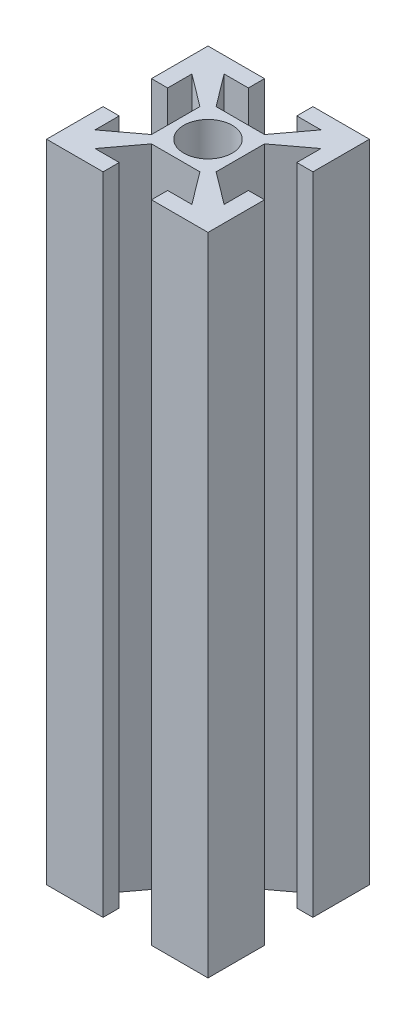
ISO-10303-21;
HEADER;
FILE_DESCRIPTION(('STEP AP214'),'2;1');
FILE_NAME('part.step','',(''),(''),'','','');
FILE_SCHEMA(('AUTOMOTIVE_DESIGN { 1 0 10303 214 1 1 1 1 }'));
ENDSEC;
DATA;
#1=APPLICATION_CONTEXT('core data for automotive mechanical design processes');
#2=APPLICATION_PROTOCOL_DEFINITION('international standard','automotive_design',2000,#1);
#3=PRODUCT_CONTEXT('',#1,'mechanical');
#4=PRODUCT('Part','Part','',(#3));
#5=PRODUCT_RELATED_PRODUCT_CATEGORY('part','',(#4));
#6=PRODUCT_DEFINITION_FORMATION('','',#4);
#7=PRODUCT_DEFINITION_CONTEXT('part definition',#1,'design');
#8=PRODUCT_DEFINITION('design','',#6,#7);
#9=PRODUCT_DEFINITION_SHAPE('','',#8);
#10=(LENGTH_UNIT() NAMED_UNIT(*) SI_UNIT(.MILLI.,.METRE.));
#11=(NAMED_UNIT(*) PLANE_ANGLE_UNIT() SI_UNIT($,.RADIAN.));
#12=(NAMED_UNIT(*) SI_UNIT($,.STERADIAN.) SOLID_ANGLE_UNIT());
#13=UNCERTAINTY_MEASURE_WITH_UNIT(LENGTH_MEASURE(1.E-05),#10,'distance_accuracy_value','');
#14=(GEOMETRIC_REPRESENTATION_CONTEXT(3) GLOBAL_UNCERTAINTY_ASSIGNED_CONTEXT((#13)) GLOBAL_UNIT_ASSIGNED_CONTEXT((#10,
#11,#12)) REPRESENTATION_CONTEXT('',''));
#15=CARTESIAN_POINT('',(0.,0.,0.));
#16=DIRECTION('',(0.,0.,1.));
#17=DIRECTION('',(1.,0.,0.));
#18=AXIS2_PLACEMENT_3D('',#15,#16,#17);
#19=CARTESIAN_POINT('',(0.,80.,-10.));
#20=DIRECTION('',(0.,0.,-1.));
#21=DIRECTION('',(-1.,0.,0.));
#22=AXIS2_PLACEMENT_3D('',#19,#20,#21);
#23=PLANE('',#22);
#24=DIRECTION('',(1.,0.,0.));
#25=VECTOR('',#24,1.);
#26=CARTESIAN_POINT('',(0.,0.,-10.));
#27=LINE('',#26,#25);
#28=CARTESIAN_POINT('',(3.,0.,-10.));
#29=VERTEX_POINT('',#28);
#30=CARTESIAN_POINT('',(10.,0.,-10.));
#31=VERTEX_POINT('',#30);
#32=EDGE_CURVE('E316',#29,#31,#27,.T.);
#33=ORIENTED_EDGE('',*,*,#32,.F.);
#34=DIRECTION('',(0.,-1.,0.));
#35=VECTOR('',#34,1.);
#36=CARTESIAN_POINT('',(3.,80.,-10.));
#37=LINE('',#36,#35);
#38=CARTESIAN_POINT('',(3.,80.,-10.));
#39=VERTEX_POINT('',#38);
#40=EDGE_CURVE('E11',#39,#29,#37,.T.);
#41=ORIENTED_EDGE('',*,*,#40,.F.);
#42=DIRECTION('',(1.,0.,0.));
#43=VECTOR('',#42,1.);
#44=CARTESIAN_POINT('',(0.,80.,-10.));
#45=LINE('',#44,#43);
#46=CARTESIAN_POINT('',(10.,80.,-10.));
#47=VERTEX_POINT('',#46);
#48=EDGE_CURVE('E586',#39,#47,#45,.T.);
#49=ORIENTED_EDGE('',*,*,#48,.T.);
#50=DIRECTION('',(0.,-1.,0.));
#51=VECTOR('',#50,1.);
#52=CARTESIAN_POINT('',(10.,80.,-10.));
#53=LINE('',#52,#51);
#54=EDGE_CURVE('E59',#47,#31,#53,.T.);
#55=ORIENTED_EDGE('',*,*,#54,.T.);
#56=EDGE_LOOP('',(#33,#41,#49,#55));
#57=FACE_BOUND('',#56,.T.);
#58=ADVANCED_FACE('F41',(#57),#23,.T.);
#59=CARTESIAN_POINT('',(3.,80.,0.));
#60=DIRECTION('',(1.,0.,0.));
#61=DIRECTION('',(0.,0.,-1.));
#62=AXIS2_PLACEMENT_3D('',#59,#60,#61);
#63=PLANE('',#62);
#64=DIRECTION('',(0.,0.,1.));
#65=VECTOR('',#64,1.);
#66=CARTESIAN_POINT('',(3.,0.,0.));
#67=LINE('',#66,#65);
#68=CARTESIAN_POINT('',(3.,0.,-8.));
#69=VERTEX_POINT('',#68);
#70=EDGE_CURVE('E319',#29,#69,#67,.T.);
#71=ORIENTED_EDGE('',*,*,#70,.T.);
#72=DIRECTION('',(0.,-1.,0.));
#73=VECTOR('',#72,1.);
#74=CARTESIAN_POINT('',(3.,80.,-8.));
#75=LINE('',#74,#73);
#76=CARTESIAN_POINT('',(3.,80.,-8.));
#77=VERTEX_POINT('',#76);
#78=EDGE_CURVE('E51',#77,#69,#75,.T.);
#79=ORIENTED_EDGE('',*,*,#78,.F.);
#80=DIRECTION('',(0.,0.,1.));
#81=VECTOR('',#80,1.);
#82=CARTESIAN_POINT('',(3.,80.,0.));
#83=LINE('',#82,#81);
#84=EDGE_CURVE('E579',#39,#77,#83,.T.);
#85=ORIENTED_EDGE('',*,*,#84,.F.);
#86=ORIENTED_EDGE('',*,*,#40,.T.);
#87=EDGE_LOOP('',(#71,#79,#85,#86));
#88=FACE_BOUND('',#87,.T.);
#89=ADVANCED_FACE('F567',(#88),#63,.F.);
#90=CARTESIAN_POINT('',(0.,80.,-7.99999999999999));
#91=DIRECTION('',(0.,0.,1.));
#92=DIRECTION('',(1.,0.,0.));
#93=AXIS2_PLACEMENT_3D('',#90,#91,#92);
#94=PLANE('',#93);
#95=DIRECTION('',(-1.,0.,0.));
#96=VECTOR('',#95,1.);
#97=CARTESIAN_POINT('',(0.,0.,-7.99999999999999));
#98=LINE('',#97,#96);
#99=CARTESIAN_POINT('',(6.,0.,-8.));
#100=VERTEX_POINT('',#99);
#101=EDGE_CURVE('E323',#100,#69,#98,.T.);
#102=ORIENTED_EDGE('',*,*,#101,.F.);
#103=DIRECTION('',(0.,-1.,0.));
#104=VECTOR('',#103,1.);
#105=CARTESIAN_POINT('',(6.,80.,-8.));
#106=LINE('',#105,#104);
#107=CARTESIAN_POINT('',(6.,80.,-8.));
#108=VERTEX_POINT('',#107);
#109=EDGE_CURVE('E555',#108,#100,#106,.T.);
#110=ORIENTED_EDGE('',*,*,#109,.F.);
#111=DIRECTION('',(-1.,0.,0.));
#112=VECTOR('',#111,1.);
#113=CARTESIAN_POINT('',(0.,80.,-7.99999999999999));
#114=LINE('',#113,#112);
#115=EDGE_CURVE('E564',#108,#77,#114,.T.);
#116=ORIENTED_EDGE('',*,*,#115,.T.);
#117=ORIENTED_EDGE('',*,*,#78,.T.);
#118=EDGE_LOOP('',(#102,#110,#116,#117));
#119=FACE_BOUND('',#118,.T.);
#120=ADVANCED_FACE('F562',(#119),#94,.T.);
#121=CARTESIAN_POINT('',(0.,80.,0.));
#122=DIRECTION('',(-0.799999999999999,0.,-0.600000000000001));
#123=DIRECTION('',(-0.600000000000001,0.,0.799999999999999));
#124=AXIS2_PLACEMENT_3D('',#121,#122,#123);
#125=PLANE('',#124);
#126=DIRECTION('',(0.600000000000001,0.,-0.799999999999999));
#127=VECTOR('',#126,1.);
#128=CARTESIAN_POINT('',(0.,0.,0.));
#129=LINE('',#128,#127);
#130=CARTESIAN_POINT('',(3.,0.,-4.00000000000002));
#131=VERTEX_POINT('',#130);
#132=EDGE_CURVE('E327',#131,#100,#129,.T.);
#133=ORIENTED_EDGE('',*,*,#132,.F.);
#134=DIRECTION('',(0.,-1.,0.));
#135=VECTOR('',#134,1.);
#136=CARTESIAN_POINT('',(3.,80.,-4.00000000000002));
#137=LINE('',#136,#135);
#138=CARTESIAN_POINT('',(3.,80.,-4.00000000000002));
#139=VERTEX_POINT('',#138);
#140=EDGE_CURVE('E552',#139,#131,#137,.T.);
#141=ORIENTED_EDGE('',*,*,#140,.F.);
#142=DIRECTION('',(0.600000000000001,0.,-0.799999999999999));
#143=VECTOR('',#142,1.);
#144=CARTESIAN_POINT('',(0.,80.,0.));
#145=LINE('',#144,#143);
#146=EDGE_CURVE('E576',#139,#108,#145,.T.);
#147=ORIENTED_EDGE('',*,*,#146,.T.);
#148=ORIENTED_EDGE('',*,*,#109,.T.);
#149=EDGE_LOOP('',(#133,#141,#147,#148));
#150=FACE_BOUND('',#149,.T.);
#151=ADVANCED_FACE('F573',(#150),#125,.T.);
#152=CARTESIAN_POINT('',(0.,80.,-4.00000000000002));
#153=DIRECTION('',(0.,0.,-1.));
#154=DIRECTION('',(-1.,0.,0.));
#155=AXIS2_PLACEMENT_3D('',#152,#153,#154);
#156=PLANE('',#155);
#157=DIRECTION('',(1.,0.,0.));
#158=VECTOR('',#157,1.);
#159=CARTESIAN_POINT('',(0.,0.,-4.00000000000002));
#160=LINE('',#159,#158);
#161=CARTESIAN_POINT('',(-3.,0.,-4.00000000000002));
#162=VERTEX_POINT('',#161);
#163=EDGE_CURVE('E331',#162,#131,#160,.T.);
#164=ORIENTED_EDGE('',*,*,#163,.F.);
#165=DIRECTION('',(0.,-1.,0.));
#166=VECTOR('',#165,1.);
#167=CARTESIAN_POINT('',(-3.,80.,-4.00000000000002));
#168=LINE('',#167,#166);
#169=CARTESIAN_POINT('',(-3.,80.,-4.00000000000002));
#170=VERTEX_POINT('',#169);
#171=EDGE_CURVE('E549',#170,#162,#168,.T.);
#172=ORIENTED_EDGE('',*,*,#171,.F.);
#173=DIRECTION('',(1.,0.,0.));
#174=VECTOR('',#173,1.);
#175=CARTESIAN_POINT('',(0.,80.,-4.00000000000002));
#176=LINE('',#175,#174);
#177=EDGE_CURVE('E584',#170,#139,#176,.T.);
#178=ORIENTED_EDGE('',*,*,#177,.T.);
#179=ORIENTED_EDGE('',*,*,#140,.T.);
#180=EDGE_LOOP('',(#164,#172,#178,#179));
#181=FACE_BOUND('',#180,.T.);
#182=ADVANCED_FACE('F722',(#181),#156,.T.);
#183=CARTESIAN_POINT('',(0.,80.,0.));
#184=DIRECTION('',(0.799999999999999,0.,-0.600000000000001));
#185=DIRECTION('',(-0.600000000000001,0.,-0.799999999999999));
#186=AXIS2_PLACEMENT_3D('',#183,#184,#185);
#187=PLANE('',#186);
#188=DIRECTION('',(0.600000000000001,0.,0.799999999999999));
#189=VECTOR('',#188,1.);
#190=CARTESIAN_POINT('',(0.,0.,0.));
#191=LINE('',#190,#189);
#192=CARTESIAN_POINT('',(-6.,0.,-8.));
#193=VERTEX_POINT('',#192);
#194=EDGE_CURVE('E335',#193,#162,#191,.T.);
#195=ORIENTED_EDGE('',*,*,#194,.F.);
#196=DIRECTION('',(0.,-1.,0.));
#197=VECTOR('',#196,1.);
#198=CARTESIAN_POINT('',(-6.,80.,-8.));
#199=LINE('',#198,#197);
#200=CARTESIAN_POINT('',(-6.,80.,-8.));
#201=VERTEX_POINT('',#200);
#202=EDGE_CURVE('E546',#201,#193,#199,.T.);
#203=ORIENTED_EDGE('',*,*,#202,.F.);
#204=DIRECTION('',(0.600000000000001,0.,0.799999999999999));
#205=VECTOR('',#204,1.);
#206=CARTESIAN_POINT('',(0.,80.,0.));
#207=LINE('',#206,#205);
#208=EDGE_CURVE('E592',#201,#170,#207,.T.);
#209=ORIENTED_EDGE('',*,*,#208,.T.);
#210=ORIENTED_EDGE('',*,*,#171,.T.);
#211=EDGE_LOOP('',(#195,#203,#209,#210));
#212=FACE_BOUND('',#211,.T.);
#213=ADVANCED_FACE('F725',(#212),#187,.T.);
#214=CARTESIAN_POINT('',(0.,80.,-8.));
#215=DIRECTION('',(0.,0.,1.));
#216=DIRECTION('',(1.,0.,0.));
#217=AXIS2_PLACEMENT_3D('',#214,#215,#216);
#218=PLANE('',#217);
#219=DIRECTION('',(-1.,0.,0.));
#220=VECTOR('',#219,1.);
#221=CARTESIAN_POINT('',(0.,0.,-8.));
#222=LINE('',#221,#220);
#223=CARTESIAN_POINT('',(-3.,0.,-8.));
#224=VERTEX_POINT('',#223);
#225=EDGE_CURVE('E339',#224,#193,#222,.T.);
#226=ORIENTED_EDGE('',*,*,#225,.F.);
#227=DIRECTION('',(0.,-1.,0.));
#228=VECTOR('',#227,1.);
#229=CARTESIAN_POINT('',(-3.,80.,-8.));
#230=LINE('',#229,#228);
#231=CARTESIAN_POINT('',(-3.,80.,-8.));
#232=VERTEX_POINT('',#231);
#233=EDGE_CURVE('E543',#232,#224,#230,.T.);
#234=ORIENTED_EDGE('',*,*,#233,.F.);
#235=DIRECTION('',(-1.,0.,0.));
#236=VECTOR('',#235,1.);
#237=CARTESIAN_POINT('',(0.,80.,-8.));
#238=LINE('',#237,#236);
#239=EDGE_CURVE('E596',#232,#201,#238,.T.);
#240=ORIENTED_EDGE('',*,*,#239,.T.);
#241=ORIENTED_EDGE('',*,*,#202,.T.);
#242=EDGE_LOOP('',(#226,#234,#240,#241));
#243=FACE_BOUND('',#242,.T.);
#244=ADVANCED_FACE('F729',(#243),#218,.T.);
#245=CARTESIAN_POINT('',(-3.,80.,0.));
#246=DIRECTION('',(-1.,0.,0.));
#247=DIRECTION('',(0.,0.,1.));
#248=AXIS2_PLACEMENT_3D('',#245,#246,#247);
#249=PLANE('',#248);
#250=DIRECTION('',(0.,0.,-1.));
#251=VECTOR('',#250,1.);
#252=CARTESIAN_POINT('',(-3.,0.,0.));
#253=LINE('',#252,#251);
#254=CARTESIAN_POINT('',(-3.,0.,-10.));
#255=VERTEX_POINT('',#254);
#256=EDGE_CURVE('E343',#224,#255,#253,.T.);
#257=ORIENTED_EDGE('',*,*,#256,.T.);
#258=DIRECTION('',(0.,-1.,0.));
#259=VECTOR('',#258,1.);
#260=CARTESIAN_POINT('',(-3.,80.,-10.));
#261=LINE('',#260,#259);
#262=CARTESIAN_POINT('',(-3.,80.,-10.));
#263=VERTEX_POINT('',#262);
#264=EDGE_CURVE('E540',#263,#255,#261,.T.);
#265=ORIENTED_EDGE('',*,*,#264,.F.);
#266=DIRECTION('',(0.,0.,-1.));
#267=VECTOR('',#266,1.);
#268=CARTESIAN_POINT('',(-3.,80.,0.));
#269=LINE('',#268,#267);
#270=EDGE_CURVE('E600',#232,#263,#269,.T.);
#271=ORIENTED_EDGE('',*,*,#270,.F.);
#272=ORIENTED_EDGE('',*,*,#233,.T.);
#273=EDGE_LOOP('',(#257,#265,#271,#272));
#274=FACE_BOUND('',#273,.T.);
#275=ADVANCED_FACE('F733',(#274),#249,.F.);
#276=CARTESIAN_POINT('',(0.,80.,-10.));
#277=DIRECTION('',(0.,0.,-1.));
#278=DIRECTION('',(-1.,0.,0.));
#279=AXIS2_PLACEMENT_3D('',#276,#277,#278);
#280=PLANE('',#279);
#281=DIRECTION('',(1.,0.,0.));
#282=VECTOR('',#281,1.);
#283=CARTESIAN_POINT('',(0.,0.,-10.));
#284=LINE('',#283,#282);
#285=CARTESIAN_POINT('',(-10.,0.,-10.));
#286=VERTEX_POINT('',#285);
#287=EDGE_CURVE('E347',#286,#255,#284,.T.);
#288=ORIENTED_EDGE('',*,*,#287,.F.);
#289=DIRECTION('',(0.,-1.,0.));
#290=VECTOR('',#289,1.);
#291=CARTESIAN_POINT('',(-10.,80.,-10.));
#292=LINE('',#291,#290);
#293=CARTESIAN_POINT('',(-10.,80.,-10.));
#294=VERTEX_POINT('',#293);
#295=EDGE_CURVE('E537',#294,#286,#292,.T.);
#296=ORIENTED_EDGE('',*,*,#295,.F.);
#297=DIRECTION('',(1.,0.,0.));
#298=VECTOR('',#297,1.);
#299=CARTESIAN_POINT('',(0.,80.,-10.));
#300=LINE('',#299,#298);
#301=EDGE_CURVE('E603',#294,#263,#300,.T.);
#302=ORIENTED_EDGE('',*,*,#301,.T.);
#303=ORIENTED_EDGE('',*,*,#264,.T.);
#304=EDGE_LOOP('',(#288,#296,#302,#303));
#305=FACE_BOUND('',#304,.T.);
#306=ADVANCED_FACE('F737',(#305),#280,.T.);
#307=CARTESIAN_POINT('',(-10.,80.,0.));
#308=DIRECTION('',(1.,0.,0.));
#309=DIRECTION('',(0.,0.,-1.));
#310=AXIS2_PLACEMENT_3D('',#307,#308,#309);
#311=PLANE('',#310);
#312=DIRECTION('',(0.,0.,1.));
#313=VECTOR('',#312,1.);
#314=CARTESIAN_POINT('',(-10.,0.,0.));
#315=LINE('',#314,#313);
#316=CARTESIAN_POINT('',(-10.,0.,-3.));
#317=VERTEX_POINT('',#316);
#318=EDGE_CURVE('E351',#286,#317,#315,.T.);
#319=ORIENTED_EDGE('',*,*,#318,.T.);
#320=DIRECTION('',(0.,-1.,0.));
#321=VECTOR('',#320,1.);
#322=CARTESIAN_POINT('',(-10.,80.,-3.));
#323=LINE('',#322,#321);
#324=CARTESIAN_POINT('',(-10.,80.,-3.));
#325=VERTEX_POINT('',#324);
#326=EDGE_CURVE('E533',#325,#317,#323,.T.);
#327=ORIENTED_EDGE('',*,*,#326,.F.);
#328=DIRECTION('',(0.,0.,1.));
#329=VECTOR('',#328,1.);
#330=CARTESIAN_POINT('',(-10.,80.,0.));
#331=LINE('',#330,#329);
#332=EDGE_CURVE('E607',#294,#325,#331,.T.);
#333=ORIENTED_EDGE('',*,*,#332,.F.);
#334=ORIENTED_EDGE('',*,*,#295,.T.);
#335=EDGE_LOOP('',(#319,#327,#333,#334));
#336=FACE_BOUND('',#335,.T.);
#337=ADVANCED_FACE('F741',(#336),#311,.F.);
#338=CARTESIAN_POINT('',(0.,80.,-3.));
#339=DIRECTION('',(0.,0.,-1.));
#340=DIRECTION('',(-1.,0.,0.));
#341=AXIS2_PLACEMENT_3D('',#338,#339,#340);
#342=PLANE('',#341);
#343=DIRECTION('',(1.,0.,0.));
#344=VECTOR('',#343,1.);
#345=CARTESIAN_POINT('',(0.,0.,-3.));
#346=LINE('',#345,#344);
#347=CARTESIAN_POINT('',(-8.,0.,-3.));
#348=VERTEX_POINT('',#347);
#349=EDGE_CURVE('E355',#317,#348,#346,.T.);
#350=ORIENTED_EDGE('',*,*,#349,.T.);
#351=DIRECTION('',(0.,-1.,0.));
#352=VECTOR('',#351,1.);
#353=CARTESIAN_POINT('',(-8.,80.,-3.));
#354=LINE('',#353,#352);
#355=CARTESIAN_POINT('',(-8.,80.,-3.));
#356=VERTEX_POINT('',#355);
#357=EDGE_CURVE('E530',#356,#348,#354,.T.);
#358=ORIENTED_EDGE('',*,*,#357,.F.);
#359=DIRECTION('',(1.,0.,0.));
#360=VECTOR('',#359,1.);
#361=CARTESIAN_POINT('',(0.,80.,-3.));
#362=LINE('',#361,#360);
#363=EDGE_CURVE('E611',#325,#356,#362,.T.);
#364=ORIENTED_EDGE('',*,*,#363,.F.);
#365=ORIENTED_EDGE('',*,*,#326,.T.);
#366=EDGE_LOOP('',(#350,#358,#364,#365));
#367=FACE_BOUND('',#366,.T.);
#368=ADVANCED_FACE('F745',(#367),#342,.F.);
#369=CARTESIAN_POINT('',(-7.99999999999999,80.,0.));
#370=DIRECTION('',(1.,0.,0.));
#371=DIRECTION('',(0.,0.,-1.));
#372=AXIS2_PLACEMENT_3D('',#369,#370,#371);
#373=PLANE('',#372);
#374=DIRECTION('',(0.,0.,1.));
#375=VECTOR('',#374,1.);
#376=CARTESIAN_POINT('',(-7.99999999999999,0.,0.));
#377=LINE('',#376,#375);
#378=CARTESIAN_POINT('',(-8.,0.,-6.));
#379=VERTEX_POINT('',#378);
#380=EDGE_CURVE('E359',#379,#348,#377,.T.);
#381=ORIENTED_EDGE('',*,*,#380,.F.);
#382=DIRECTION('',(0.,-1.,0.));
#383=VECTOR('',#382,1.);
#384=CARTESIAN_POINT('',(-8.,80.,-6.));
#385=LINE('',#384,#383);
#386=CARTESIAN_POINT('',(-8.,80.,-6.));
#387=VERTEX_POINT('',#386);
#388=EDGE_CURVE('E527',#387,#379,#385,.T.);
#389=ORIENTED_EDGE('',*,*,#388,.F.);
#390=DIRECTION('',(0.,0.,1.));
#391=VECTOR('',#390,1.);
#392=CARTESIAN_POINT('',(-7.99999999999999,80.,0.));
#393=LINE('',#392,#391);
#394=EDGE_CURVE('E614',#387,#356,#393,.T.);
#395=ORIENTED_EDGE('',*,*,#394,.T.);
#396=ORIENTED_EDGE('',*,*,#357,.T.);
#397=EDGE_LOOP('',(#381,#389,#395,#396));
#398=FACE_BOUND('',#397,.T.);
#399=ADVANCED_FACE('F749',(#398),#373,.T.);
#400=CARTESIAN_POINT('',(0.,80.,0.));
#401=DIRECTION('',(-0.600000000000001,0.,0.799999999999999));
#402=DIRECTION('',(0.799999999999999,0.,0.600000000000001));
#403=AXIS2_PLACEMENT_3D('',#400,#401,#402);
#404=PLANE('',#403);
#405=DIRECTION('',(-0.799999999999999,0.,-0.600000000000001));
#406=VECTOR('',#405,1.);
#407=CARTESIAN_POINT('',(0.,0.,0.));
#408=LINE('',#407,#406);
#409=CARTESIAN_POINT('',(-4.00000000000002,0.,-3.));
#410=VERTEX_POINT('',#409);
#411=EDGE_CURVE('E363',#410,#379,#408,.T.);
#412=ORIENTED_EDGE('',*,*,#411,.F.);
#413=DIRECTION('',(0.,-1.,0.));
#414=VECTOR('',#413,1.);
#415=CARTESIAN_POINT('',(-4.00000000000002,80.,-3.));
#416=LINE('',#415,#414);
#417=CARTESIAN_POINT('',(-4.00000000000002,80.,-3.));
#418=VERTEX_POINT('',#417);
#419=EDGE_CURVE('E524',#418,#410,#416,.T.);
#420=ORIENTED_EDGE('',*,*,#419,.F.);
#421=DIRECTION('',(-0.799999999999999,0.,-0.600000000000001));
#422=VECTOR('',#421,1.);
#423=CARTESIAN_POINT('',(0.,80.,0.));
#424=LINE('',#423,#422);
#425=EDGE_CURVE('E618',#418,#387,#424,.T.);
#426=ORIENTED_EDGE('',*,*,#425,.T.);
#427=ORIENTED_EDGE('',*,*,#388,.T.);
#428=EDGE_LOOP('',(#412,#420,#426,#427));
#429=FACE_BOUND('',#428,.T.);
#430=ADVANCED_FACE('F753',(#429),#404,.T.);
#431=CARTESIAN_POINT('',(-4.00000000000002,80.,0.));
#432=DIRECTION('',(-1.,0.,0.));
#433=DIRECTION('',(0.,0.,1.));
#434=AXIS2_PLACEMENT_3D('',#431,#432,#433);
#435=PLANE('',#434);
#436=DIRECTION('',(0.,0.,-1.));
#437=VECTOR('',#436,1.);
#438=CARTESIAN_POINT('',(-4.00000000000002,0.,0.));
#439=LINE('',#438,#437);
#440=CARTESIAN_POINT('',(-4.00000000000002,0.,3.));
#441=VERTEX_POINT('',#440);
#442=EDGE_CURVE('E367',#441,#410,#439,.T.);
#443=ORIENTED_EDGE('',*,*,#442,.F.);
#444=DIRECTION('',(0.,-1.,0.));
#445=VECTOR('',#444,1.);
#446=CARTESIAN_POINT('',(-4.00000000000002,80.,3.));
#447=LINE('',#446,#445);
#448=CARTESIAN_POINT('',(-4.00000000000002,80.,3.));
#449=VERTEX_POINT('',#448);
#450=EDGE_CURVE('E521',#449,#441,#447,.T.);
#451=ORIENTED_EDGE('',*,*,#450,.F.);
#452=DIRECTION('',(0.,0.,-1.));
#453=VECTOR('',#452,1.);
#454=CARTESIAN_POINT('',(-4.00000000000002,80.,0.));
#455=LINE('',#454,#453);
#456=EDGE_CURVE('E622',#449,#418,#455,.T.);
#457=ORIENTED_EDGE('',*,*,#456,.T.);
#458=ORIENTED_EDGE('',*,*,#419,.T.);
#459=EDGE_LOOP('',(#443,#451,#457,#458));
#460=FACE_BOUND('',#459,.T.);
#461=ADVANCED_FACE('F757',(#460),#435,.T.);
#462=CARTESIAN_POINT('',(0.,80.,0.));
#463=DIRECTION('',(-0.600000000000001,0.,-0.799999999999999));
#464=DIRECTION('',(-0.799999999999999,0.,0.600000000000001));
#465=AXIS2_PLACEMENT_3D('',#462,#463,#464);
#466=PLANE('',#465);
#467=DIRECTION('',(0.799999999999999,0.,-0.600000000000001));
#468=VECTOR('',#467,1.);
#469=CARTESIAN_POINT('',(0.,0.,0.));
#470=LINE('',#469,#468);
#471=CARTESIAN_POINT('',(-8.,0.,6.));
#472=VERTEX_POINT('',#471);
#473=EDGE_CURVE('E371',#472,#441,#470,.T.);
#474=ORIENTED_EDGE('',*,*,#473,.F.);
#475=DIRECTION('',(0.,-1.,0.));
#476=VECTOR('',#475,1.);
#477=CARTESIAN_POINT('',(-8.,80.,6.));
#478=LINE('',#477,#476);
#479=CARTESIAN_POINT('',(-8.,80.,6.));
#480=VERTEX_POINT('',#479);
#481=EDGE_CURVE('E518',#480,#472,#478,.T.);
#482=ORIENTED_EDGE('',*,*,#481,.F.);
#483=DIRECTION('',(0.799999999999999,0.,-0.600000000000001));
#484=VECTOR('',#483,1.);
#485=CARTESIAN_POINT('',(0.,80.,0.));
#486=LINE('',#485,#484);
#487=EDGE_CURVE('E626',#480,#449,#486,.T.);
#488=ORIENTED_EDGE('',*,*,#487,.T.);
#489=ORIENTED_EDGE('',*,*,#450,.T.);
#490=EDGE_LOOP('',(#474,#482,#488,#489));
#491=FACE_BOUND('',#490,.T.);
#492=ADVANCED_FACE('F761',(#491),#466,.T.);
#493=CARTESIAN_POINT('',(-8.,80.,0.));
#494=DIRECTION('',(1.,0.,0.));
#495=DIRECTION('',(0.,0.,-1.));
#496=AXIS2_PLACEMENT_3D('',#493,#494,#495);
#497=PLANE('',#496);
#498=DIRECTION('',(0.,0.,1.));
#499=VECTOR('',#498,1.);
#500=CARTESIAN_POINT('',(-8.,0.,0.));
#501=LINE('',#500,#499);
#502=CARTESIAN_POINT('',(-8.,0.,3.));
#503=VERTEX_POINT('',#502);
#504=EDGE_CURVE('E375',#503,#472,#501,.T.);
#505=ORIENTED_EDGE('',*,*,#504,.F.);
#506=DIRECTION('',(0.,-1.,0.));
#507=VECTOR('',#506,1.);
#508=CARTESIAN_POINT('',(-8.,80.,3.));
#509=LINE('',#508,#507);
#510=CARTESIAN_POINT('',(-8.,80.,3.));
#511=VERTEX_POINT('',#510);
#512=EDGE_CURVE('E515',#511,#503,#509,.T.);
#513=ORIENTED_EDGE('',*,*,#512,.F.);
#514=DIRECTION('',(0.,0.,1.));
#515=VECTOR('',#514,1.);
#516=CARTESIAN_POINT('',(-8.,80.,0.));
#517=LINE('',#516,#515);
#518=EDGE_CURVE('E630',#511,#480,#517,.T.);
#519=ORIENTED_EDGE('',*,*,#518,.T.);
#520=ORIENTED_EDGE('',*,*,#481,.T.);
#521=EDGE_LOOP('',(#505,#513,#519,#520));
#522=FACE_BOUND('',#521,.T.);
#523=ADVANCED_FACE('F765',(#522),#497,.T.);
#524=CARTESIAN_POINT('',(0.,80.,3.));
#525=DIRECTION('',(0.,0.,1.));
#526=DIRECTION('',(1.,0.,0.));
#527=AXIS2_PLACEMENT_3D('',#524,#525,#526);
#528=PLANE('',#527);
#529=DIRECTION('',(-1.,0.,0.));
#530=VECTOR('',#529,1.);
#531=CARTESIAN_POINT('',(0.,0.,3.));
#532=LINE('',#531,#530);
#533=CARTESIAN_POINT('',(-10.,0.,3.));
#534=VERTEX_POINT('',#533);
#535=EDGE_CURVE('E379',#503,#534,#532,.T.);
#536=ORIENTED_EDGE('',*,*,#535,.T.);
#537=DIRECTION('',(0.,-1.,0.));
#538=VECTOR('',#537,1.);
#539=CARTESIAN_POINT('',(-10.,80.,3.));
#540=LINE('',#539,#538);
#541=CARTESIAN_POINT('',(-10.,80.,3.));
#542=VERTEX_POINT('',#541);
#543=EDGE_CURVE('E511',#542,#534,#540,.T.);
#544=ORIENTED_EDGE('',*,*,#543,.F.);
#545=DIRECTION('',(-1.,0.,0.));
#546=VECTOR('',#545,1.);
#547=CARTESIAN_POINT('',(0.,80.,3.));
#548=LINE('',#547,#546);
#549=EDGE_CURVE('E634',#511,#542,#548,.T.);
#550=ORIENTED_EDGE('',*,*,#549,.F.);
#551=ORIENTED_EDGE('',*,*,#512,.T.);
#552=EDGE_LOOP('',(#536,#544,#550,#551));
#553=FACE_BOUND('',#552,.T.);
#554=ADVANCED_FACE('F769',(#553),#528,.F.);
#555=CARTESIAN_POINT('',(-10.,80.,0.));
#556=DIRECTION('',(1.,0.,0.));
#557=DIRECTION('',(0.,0.,-1.));
#558=AXIS2_PLACEMENT_3D('',#555,#556,#557);
#559=PLANE('',#558);
#560=DIRECTION('',(0.,0.,1.));
#561=VECTOR('',#560,1.);
#562=CARTESIAN_POINT('',(-10.,0.,0.));
#563=LINE('',#562,#561);
#564=CARTESIAN_POINT('',(-10.,0.,10.));
#565=VERTEX_POINT('',#564);
#566=EDGE_CURVE('E383',#534,#565,#563,.T.);
#567=ORIENTED_EDGE('',*,*,#566,.T.);
#568=DIRECTION('',(0.,-1.,0.));
#569=VECTOR('',#568,1.);
#570=CARTESIAN_POINT('',(-10.,80.,10.));
#571=LINE('',#570,#569);
#572=CARTESIAN_POINT('',(-10.,80.,10.));
#573=VERTEX_POINT('',#572);
#574=EDGE_CURVE('E507',#573,#565,#571,.T.);
#575=ORIENTED_EDGE('',*,*,#574,.F.);
#576=DIRECTION('',(0.,0.,1.));
#577=VECTOR('',#576,1.);
#578=CARTESIAN_POINT('',(-10.,80.,0.));
#579=LINE('',#578,#577);
#580=EDGE_CURVE('E638',#542,#573,#579,.T.);
#581=ORIENTED_EDGE('',*,*,#580,.F.);
#582=ORIENTED_EDGE('',*,*,#543,.T.);
#583=EDGE_LOOP('',(#567,#575,#581,#582));
#584=FACE_BOUND('',#583,.T.);
#585=ADVANCED_FACE('F773',(#584),#559,.F.);
#586=CARTESIAN_POINT('',(0.,80.,10.));
#587=DIRECTION('',(0.,0.,-1.));
#588=DIRECTION('',(-1.,0.,0.));
#589=AXIS2_PLACEMENT_3D('',#586,#587,#588);
#590=PLANE('',#589);
#591=DIRECTION('',(1.,0.,0.));
#592=VECTOR('',#591,1.);
#593=CARTESIAN_POINT('',(0.,0.,10.));
#594=LINE('',#593,#592);
#595=CARTESIAN_POINT('',(-3.,0.,10.));
#596=VERTEX_POINT('',#595);
#597=EDGE_CURVE('E387',#565,#596,#594,.T.);
#598=ORIENTED_EDGE('',*,*,#597,.T.);
#599=DIRECTION('',(0.,-1.,0.));
#600=VECTOR('',#599,1.);
#601=CARTESIAN_POINT('',(-3.,80.,10.));
#602=LINE('',#601,#600);
#603=CARTESIAN_POINT('',(-3.,80.,10.));
#604=VERTEX_POINT('',#603);
#605=EDGE_CURVE('E503',#604,#596,#602,.T.);
#606=ORIENTED_EDGE('',*,*,#605,.F.);
#607=DIRECTION('',(1.,0.,0.));
#608=VECTOR('',#607,1.);
#609=CARTESIAN_POINT('',(0.,80.,10.));
#610=LINE('',#609,#608);
#611=EDGE_CURVE('E642',#573,#604,#610,.T.);
#612=ORIENTED_EDGE('',*,*,#611,.F.);
#613=ORIENTED_EDGE('',*,*,#574,.T.);
#614=EDGE_LOOP('',(#598,#606,#612,#613));
#615=FACE_BOUND('',#614,.T.);
#616=ADVANCED_FACE('F777',(#615),#590,.F.);
#617=CARTESIAN_POINT('',(-3.,80.,0.));
#618=DIRECTION('',(-1.,0.,0.));
#619=DIRECTION('',(0.,0.,1.));
#620=AXIS2_PLACEMENT_3D('',#617,#618,#619);
#621=PLANE('',#620);
#622=DIRECTION('',(0.,0.,-1.));
#623=VECTOR('',#622,1.);
#624=CARTESIAN_POINT('',(-3.,0.,0.));
#625=LINE('',#624,#623);
#626=CARTESIAN_POINT('',(-3.,0.,8.));
#627=VERTEX_POINT('',#626);
#628=EDGE_CURVE('E391',#596,#627,#625,.T.);
#629=ORIENTED_EDGE('',*,*,#628,.T.);
#630=DIRECTION('',(0.,-1.,0.));
#631=VECTOR('',#630,1.);
#632=CARTESIAN_POINT('',(-3.,80.,8.));
#633=LINE('',#632,#631);
#634=CARTESIAN_POINT('',(-3.,80.,8.));
#635=VERTEX_POINT('',#634);
#636=EDGE_CURVE('E500',#635,#627,#633,.T.);
#637=ORIENTED_EDGE('',*,*,#636,.F.);
#638=DIRECTION('',(0.,0.,-1.));
#639=VECTOR('',#638,1.);
#640=CARTESIAN_POINT('',(-3.,80.,0.));
#641=LINE('',#640,#639);
#642=EDGE_CURVE('E646',#604,#635,#641,.T.);
#643=ORIENTED_EDGE('',*,*,#642,.F.);
#644=ORIENTED_EDGE('',*,*,#605,.T.);
#645=EDGE_LOOP('',(#629,#637,#643,#644));
#646=FACE_BOUND('',#645,.T.);
#647=ADVANCED_FACE('F781',(#646),#621,.F.);
#648=CARTESIAN_POINT('',(0.,80.,7.99999999999999));
#649=DIRECTION('',(0.,0.,-1.));
#650=DIRECTION('',(-1.,0.,0.));
#651=AXIS2_PLACEMENT_3D('',#648,#649,#650);
#652=PLANE('',#651);
#653=DIRECTION('',(1.,0.,0.));
#654=VECTOR('',#653,1.);
#655=CARTESIAN_POINT('',(0.,0.,7.99999999999999));
#656=LINE('',#655,#654);
#657=CARTESIAN_POINT('',(-6.,0.,8.));
#658=VERTEX_POINT('',#657);
#659=EDGE_CURVE('E395',#658,#627,#656,.T.);
#660=ORIENTED_EDGE('',*,*,#659,.F.);
#661=DIRECTION('',(0.,-1.,0.));
#662=VECTOR('',#661,1.);
#663=CARTESIAN_POINT('',(-6.,80.,8.));
#664=LINE('',#663,#662);
#665=CARTESIAN_POINT('',(-6.,80.,8.));
#666=VERTEX_POINT('',#665);
#667=EDGE_CURVE('E497',#666,#658,#664,.T.);
#668=ORIENTED_EDGE('',*,*,#667,.F.);
#669=DIRECTION('',(1.,0.,0.));
#670=VECTOR('',#669,1.);
#671=CARTESIAN_POINT('',(0.,80.,7.99999999999999));
#672=LINE('',#671,#670);
#673=EDGE_CURVE('E649',#666,#635,#672,.T.);
#674=ORIENTED_EDGE('',*,*,#673,.T.);
#675=ORIENTED_EDGE('',*,*,#636,.T.);
#676=EDGE_LOOP('',(#660,#668,#674,#675));
#677=FACE_BOUND('',#676,.T.);
#678=ADVANCED_FACE('F785',(#677),#652,.T.);
#679=CARTESIAN_POINT('',(0.,80.,0.));
#680=DIRECTION('',(0.799999999999999,0.,0.600000000000001));
#681=DIRECTION('',(0.600000000000001,0.,-0.799999999999999));
#682=AXIS2_PLACEMENT_3D('',#679,#680,#681);
#683=PLANE('',#682);
#684=DIRECTION('',(-0.600000000000001,0.,0.799999999999999));
#685=VECTOR('',#684,1.);
#686=CARTESIAN_POINT('',(0.,0.,0.));
#687=LINE('',#686,#685);
#688=CARTESIAN_POINT('',(-3.,0.,4.00000000000002));
#689=VERTEX_POINT('',#688);
#690=EDGE_CURVE('E399',#689,#658,#687,.T.);
#691=ORIENTED_EDGE('',*,*,#690,.F.);
#692=DIRECTION('',(0.,-1.,0.));
#693=VECTOR('',#692,1.);
#694=CARTESIAN_POINT('',(-3.,80.,4.00000000000002));
#695=LINE('',#694,#693);
#696=CARTESIAN_POINT('',(-3.,80.,4.00000000000002));
#697=VERTEX_POINT('',#696);
#698=EDGE_CURVE('E494',#697,#689,#695,.T.);
#699=ORIENTED_EDGE('',*,*,#698,.F.);
#700=DIRECTION('',(-0.600000000000001,0.,0.799999999999999));
#701=VECTOR('',#700,1.);
#702=CARTESIAN_POINT('',(0.,80.,0.));
#703=LINE('',#702,#701);
#704=EDGE_CURVE('E653',#697,#666,#703,.T.);
#705=ORIENTED_EDGE('',*,*,#704,.T.);
#706=ORIENTED_EDGE('',*,*,#667,.T.);
#707=EDGE_LOOP('',(#691,#699,#705,#706));
#708=FACE_BOUND('',#707,.T.);
#709=ADVANCED_FACE('F789',(#708),#683,.T.);
#710=CARTESIAN_POINT('',(0.,80.,4.00000000000002));
#711=DIRECTION('',(0.,0.,-1.));
#712=DIRECTION('',(-1.,0.,0.));
#713=AXIS2_PLACEMENT_3D('',#710,#711,#712);
#714=PLANE('',#713);
#715=DIRECTION('',(1.,0.,0.));
#716=VECTOR('',#715,1.);
#717=CARTESIAN_POINT('',(0.,0.,4.00000000000002));
#718=LINE('',#717,#716);
#719=CARTESIAN_POINT('',(3.,0.,4.00000000000002));
#720=VERTEX_POINT('',#719);
#721=EDGE_CURVE('E403',#689,#720,#718,.T.);
#722=ORIENTED_EDGE('',*,*,#721,.T.);
#723=DIRECTION('',(0.,-1.,0.));
#724=VECTOR('',#723,1.);
#725=CARTESIAN_POINT('',(3.,80.,4.00000000000002));
#726=LINE('',#725,#724);
#727=CARTESIAN_POINT('',(3.,80.,4.00000000000002));
#728=VERTEX_POINT('',#727);
#729=EDGE_CURVE('E491',#728,#720,#726,.T.);
#730=ORIENTED_EDGE('',*,*,#729,.F.);
#731=DIRECTION('',(1.,0.,0.));
#732=VECTOR('',#731,1.);
#733=CARTESIAN_POINT('',(0.,80.,4.00000000000002));
#734=LINE('',#733,#732);
#735=EDGE_CURVE('E657',#697,#728,#734,.T.);
#736=ORIENTED_EDGE('',*,*,#735,.F.);
#737=ORIENTED_EDGE('',*,*,#698,.T.);
#738=EDGE_LOOP('',(#722,#730,#736,#737));
#739=FACE_BOUND('',#738,.T.);
#740=ADVANCED_FACE('F793',(#739),#714,.F.);
#741=CARTESIAN_POINT('',(0.,80.,0.));
#742=DIRECTION('',(-0.799999999999999,0.,0.600000000000002));
#743=DIRECTION('',(0.600000000000002,0.,0.799999999999999));
#744=AXIS2_PLACEMENT_3D('',#741,#742,#743);
#745=PLANE('',#744);
#746=DIRECTION('',(-0.600000000000002,0.,-0.799999999999999));
#747=VECTOR('',#746,1.);
#748=CARTESIAN_POINT('',(0.,0.,0.));
#749=LINE('',#748,#747);
#750=CARTESIAN_POINT('',(6.,0.,8.));
#751=VERTEX_POINT('',#750);
#752=EDGE_CURVE('E407',#751,#720,#749,.T.);
#753=ORIENTED_EDGE('',*,*,#752,.F.);
#754=DIRECTION('',(0.,-1.,0.));
#755=VECTOR('',#754,1.);
#756=CARTESIAN_POINT('',(6.,80.,8.));
#757=LINE('',#756,#755);
#758=CARTESIAN_POINT('',(6.,80.,8.));
#759=VERTEX_POINT('',#758);
#760=EDGE_CURVE('E488',#759,#751,#757,.T.);
#761=ORIENTED_EDGE('',*,*,#760,.F.);
#762=DIRECTION('',(-0.600000000000002,0.,-0.799999999999999));
#763=VECTOR('',#762,1.);
#764=CARTESIAN_POINT('',(0.,80.,0.));
#765=LINE('',#764,#763);
#766=EDGE_CURVE('E660',#759,#728,#765,.T.);
#767=ORIENTED_EDGE('',*,*,#766,.T.);
#768=ORIENTED_EDGE('',*,*,#729,.T.);
#769=EDGE_LOOP('',(#753,#761,#767,#768));
#770=FACE_BOUND('',#769,.T.);
#771=ADVANCED_FACE('F797',(#770),#745,.T.);
#772=CARTESIAN_POINT('',(0.,80.,8.));
#773=DIRECTION('',(0.,0.,-1.));
#774=DIRECTION('',(-1.,0.,0.));
#775=AXIS2_PLACEMENT_3D('',#772,#773,#774);
#776=PLANE('',#775);
#777=DIRECTION('',(1.,0.,0.));
#778=VECTOR('',#777,1.);
#779=CARTESIAN_POINT('',(0.,0.,8.));
#780=LINE('',#779,#778);
#781=CARTESIAN_POINT('',(3.,0.,8.));
#782=VERTEX_POINT('',#781);
#783=EDGE_CURVE('E411',#782,#751,#780,.T.);
#784=ORIENTED_EDGE('',*,*,#783,.F.);
#785=DIRECTION('',(0.,-1.,0.));
#786=VECTOR('',#785,1.);
#787=CARTESIAN_POINT('',(3.,80.,8.));
#788=LINE('',#787,#786);
#789=CARTESIAN_POINT('',(3.,80.,8.));
#790=VERTEX_POINT('',#789);
#791=EDGE_CURVE('E485',#790,#782,#788,.T.);
#792=ORIENTED_EDGE('',*,*,#791,.F.);
#793=DIRECTION('',(1.,0.,0.));
#794=VECTOR('',#793,1.);
#795=CARTESIAN_POINT('',(0.,80.,8.));
#796=LINE('',#795,#794);
#797=EDGE_CURVE('E664',#790,#759,#796,.T.);
#798=ORIENTED_EDGE('',*,*,#797,.T.);
#799=ORIENTED_EDGE('',*,*,#760,.T.);
#800=EDGE_LOOP('',(#784,#792,#798,#799));
#801=FACE_BOUND('',#800,.T.);
#802=ADVANCED_FACE('F801',(#801),#776,.T.);
#803=CARTESIAN_POINT('',(3.,80.,0.));
#804=DIRECTION('',(1.,0.,0.));
#805=DIRECTION('',(0.,0.,-1.));
#806=AXIS2_PLACEMENT_3D('',#803,#804,#805);
#807=PLANE('',#806);
#808=DIRECTION('',(0.,0.,1.));
#809=VECTOR('',#808,1.);
#810=CARTESIAN_POINT('',(3.,0.,0.));
#811=LINE('',#810,#809);
#812=CARTESIAN_POINT('',(3.,0.,10.));
#813=VERTEX_POINT('',#812);
#814=EDGE_CURVE('E415',#782,#813,#811,.T.);
#815=ORIENTED_EDGE('',*,*,#814,.T.);
#816=DIRECTION('',(0.,-1.,0.));
#817=VECTOR('',#816,1.);
#818=CARTESIAN_POINT('',(3.,80.,10.));
#819=LINE('',#818,#817);
#820=CARTESIAN_POINT('',(3.,80.,10.));
#821=VERTEX_POINT('',#820);
#822=EDGE_CURVE('E481',#821,#813,#819,.T.);
#823=ORIENTED_EDGE('',*,*,#822,.F.);
#824=DIRECTION('',(0.,0.,1.));
#825=VECTOR('',#824,1.);
#826=CARTESIAN_POINT('',(3.,80.,0.));
#827=LINE('',#826,#825);
#828=EDGE_CURVE('E668',#790,#821,#827,.T.);
#829=ORIENTED_EDGE('',*,*,#828,.F.);
#830=ORIENTED_EDGE('',*,*,#791,.T.);
#831=EDGE_LOOP('',(#815,#823,#829,#830));
#832=FACE_BOUND('',#831,.T.);
#833=ADVANCED_FACE('F805',(#832),#807,.F.);
#834=CARTESIAN_POINT('',(0.,80.,10.));
#835=DIRECTION('',(0.,0.,-1.));
#836=DIRECTION('',(-1.,0.,0.));
#837=AXIS2_PLACEMENT_3D('',#834,#835,#836);
#838=PLANE('',#837);
#839=DIRECTION('',(1.,0.,0.));
#840=VECTOR('',#839,1.);
#841=CARTESIAN_POINT('',(0.,0.,10.));
#842=LINE('',#841,#840);
#843=CARTESIAN_POINT('',(10.,0.,10.));
#844=VERTEX_POINT('',#843);
#845=EDGE_CURVE('E419',#813,#844,#842,.T.);
#846=ORIENTED_EDGE('',*,*,#845,.T.);
#847=DIRECTION('',(0.,-1.,0.));
#848=VECTOR('',#847,1.);
#849=CARTESIAN_POINT('',(10.,80.,10.));
#850=LINE('',#849,#848);
#851=CARTESIAN_POINT('',(10.,80.,10.));
#852=VERTEX_POINT('',#851);
#853=EDGE_CURVE('E478',#852,#844,#850,.T.);
#854=ORIENTED_EDGE('',*,*,#853,.F.);
#855=DIRECTION('',(1.,0.,0.));
#856=VECTOR('',#855,1.);
#857=CARTESIAN_POINT('',(0.,80.,10.));
#858=LINE('',#857,#856);
#859=EDGE_CURVE('E672',#821,#852,#858,.T.);
#860=ORIENTED_EDGE('',*,*,#859,.F.);
#861=ORIENTED_EDGE('',*,*,#822,.T.);
#862=EDGE_LOOP('',(#846,#854,#860,#861));
#863=FACE_BOUND('',#862,.T.);
#864=ADVANCED_FACE('F809',(#863),#838,.F.);
#865=CARTESIAN_POINT('',(10.,80.,0.));
#866=DIRECTION('',(1.,0.,0.));
#867=DIRECTION('',(0.,0.,-1.));
#868=AXIS2_PLACEMENT_3D('',#865,#866,#867);
#869=PLANE('',#868);
#870=DIRECTION('',(0.,0.,1.));
#871=VECTOR('',#870,1.);
#872=CARTESIAN_POINT('',(10.,0.,0.));
#873=LINE('',#872,#871);
#874=CARTESIAN_POINT('',(10.,0.,3.));
#875=VERTEX_POINT('',#874);
#876=EDGE_CURVE('E423',#875,#844,#873,.T.);
#877=ORIENTED_EDGE('',*,*,#876,.F.);
#878=DIRECTION('',(0.,-1.,0.));
#879=VECTOR('',#878,1.);
#880=CARTESIAN_POINT('',(10.,80.,3.));
#881=LINE('',#880,#879);
#882=CARTESIAN_POINT('',(10.,80.,3.));
#883=VERTEX_POINT('',#882);
#884=EDGE_CURVE('E475',#883,#875,#881,.T.);
#885=ORIENTED_EDGE('',*,*,#884,.F.);
#886=DIRECTION('',(0.,0.,1.));
#887=VECTOR('',#886,1.);
#888=CARTESIAN_POINT('',(10.,80.,0.));
#889=LINE('',#888,#887);
#890=EDGE_CURVE('E675',#883,#852,#889,.T.);
#891=ORIENTED_EDGE('',*,*,#890,.T.);
#892=ORIENTED_EDGE('',*,*,#853,.T.);
#893=EDGE_LOOP('',(#877,#885,#891,#892));
#894=FACE_BOUND('',#893,.T.);
#895=ADVANCED_FACE('F813',(#894),#869,.T.);
#896=CARTESIAN_POINT('',(0.,80.,3.));
#897=DIRECTION('',(0.,0.,1.));
#898=DIRECTION('',(1.,0.,0.));
#899=AXIS2_PLACEMENT_3D('',#896,#897,#898);
#900=PLANE('',#899);
#901=DIRECTION('',(-1.,0.,0.));
#902=VECTOR('',#901,1.);
#903=CARTESIAN_POINT('',(0.,0.,3.));
#904=LINE('',#903,#902);
#905=CARTESIAN_POINT('',(8.,0.,3.));
#906=VERTEX_POINT('',#905);
#907=EDGE_CURVE('E427',#875,#906,#904,.T.);
#908=ORIENTED_EDGE('',*,*,#907,.T.);
#909=DIRECTION('',(0.,-1.,0.));
#910=VECTOR('',#909,1.);
#911=CARTESIAN_POINT('',(8.,80.,3.));
#912=LINE('',#911,#910);
#913=CARTESIAN_POINT('',(8.,80.,3.));
#914=VERTEX_POINT('',#913);
#915=EDGE_CURVE('E472',#914,#906,#912,.T.);
#916=ORIENTED_EDGE('',*,*,#915,.F.);
#917=DIRECTION('',(-1.,0.,0.));
#918=VECTOR('',#917,1.);
#919=CARTESIAN_POINT('',(0.,80.,3.));
#920=LINE('',#919,#918);
#921=EDGE_CURVE('E679',#883,#914,#920,.T.);
#922=ORIENTED_EDGE('',*,*,#921,.F.);
#923=ORIENTED_EDGE('',*,*,#884,.T.);
#924=EDGE_LOOP('',(#908,#916,#922,#923));
#925=FACE_BOUND('',#924,.T.);
#926=ADVANCED_FACE('F817',(#925),#900,.F.);
#927=CARTESIAN_POINT('',(7.99999999999999,80.,0.));
#928=DIRECTION('',(-1.,0.,0.));
#929=DIRECTION('',(0.,0.,1.));
#930=AXIS2_PLACEMENT_3D('',#927,#928,#929);
#931=PLANE('',#930);
#932=DIRECTION('',(0.,0.,-1.));
#933=VECTOR('',#932,1.);
#934=CARTESIAN_POINT('',(7.99999999999999,0.,0.));
#935=LINE('',#934,#933);
#936=CARTESIAN_POINT('',(8.,0.,6.));
#937=VERTEX_POINT('',#936);
#938=EDGE_CURVE('E431',#937,#906,#935,.T.);
#939=ORIENTED_EDGE('',*,*,#938,.F.);
#940=DIRECTION('',(0.,-1.,0.));
#941=VECTOR('',#940,1.);
#942=CARTESIAN_POINT('',(8.,80.,6.));
#943=LINE('',#942,#941);
#944=CARTESIAN_POINT('',(8.,80.,6.));
#945=VERTEX_POINT('',#944);
#946=EDGE_CURVE('E469',#945,#937,#943,.T.);
#947=ORIENTED_EDGE('',*,*,#946,.F.);
#948=DIRECTION('',(0.,0.,-1.));
#949=VECTOR('',#948,1.);
#950=CARTESIAN_POINT('',(7.99999999999999,80.,0.));
#951=LINE('',#950,#949);
#952=EDGE_CURVE('E682',#945,#914,#951,.T.);
#953=ORIENTED_EDGE('',*,*,#952,.T.);
#954=ORIENTED_EDGE('',*,*,#915,.T.);
#955=EDGE_LOOP('',(#939,#947,#953,#954));
#956=FACE_BOUND('',#955,.T.);
#957=ADVANCED_FACE('F821',(#956),#931,.T.);
#958=CARTESIAN_POINT('',(0.,80.,0.));
#959=DIRECTION('',(0.600000000000002,0.,-0.799999999999999));
#960=DIRECTION('',(-0.799999999999999,0.,-0.600000000000002));
#961=AXIS2_PLACEMENT_3D('',#958,#959,#960);
#962=PLANE('',#961);
#963=DIRECTION('',(0.799999999999999,0.,0.600000000000002));
#964=VECTOR('',#963,1.);
#965=CARTESIAN_POINT('',(0.,0.,0.));
#966=LINE('',#965,#964);
#967=CARTESIAN_POINT('',(4.00000000000002,0.,3.));
#968=VERTEX_POINT('',#967);
#969=EDGE_CURVE('E435',#968,#937,#966,.T.);
#970=ORIENTED_EDGE('',*,*,#969,.F.);
#971=DIRECTION('',(0.,-1.,0.));
#972=VECTOR('',#971,1.);
#973=CARTESIAN_POINT('',(4.00000000000002,80.,3.));
#974=LINE('',#973,#972);
#975=CARTESIAN_POINT('',(4.00000000000002,80.,3.));
#976=VERTEX_POINT('',#975);
#977=EDGE_CURVE('E466',#976,#968,#974,.T.);
#978=ORIENTED_EDGE('',*,*,#977,.F.);
#979=DIRECTION('',(0.799999999999999,0.,0.600000000000002));
#980=VECTOR('',#979,1.);
#981=CARTESIAN_POINT('',(0.,80.,0.));
#982=LINE('',#981,#980);
#983=EDGE_CURVE('E686',#976,#945,#982,.T.);
#984=ORIENTED_EDGE('',*,*,#983,.T.);
#985=ORIENTED_EDGE('',*,*,#946,.T.);
#986=EDGE_LOOP('',(#970,#978,#984,#985));
#987=FACE_BOUND('',#986,.T.);
#988=ADVANCED_FACE('F825',(#987),#962,.T.);
#989=CARTESIAN_POINT('',(4.00000000000002,80.,0.));
#990=DIRECTION('',(1.,0.,0.));
#991=DIRECTION('',(0.,0.,-1.));
#992=AXIS2_PLACEMENT_3D('',#989,#990,#991);
#993=PLANE('',#992);
#994=DIRECTION('',(0.,0.,1.));
#995=VECTOR('',#994,1.);
#996=CARTESIAN_POINT('',(4.00000000000002,0.,0.));
#997=LINE('',#996,#995);
#998=CARTESIAN_POINT('',(4.00000000000002,0.,-3.));
#999=VERTEX_POINT('',#998);
#1000=EDGE_CURVE('E439',#999,#968,#997,.T.);
#1001=ORIENTED_EDGE('',*,*,#1000,.F.);
#1002=DIRECTION('',(0.,-1.,0.));
#1003=VECTOR('',#1002,1.);
#1004=CARTESIAN_POINT('',(4.00000000000002,80.,-3.));
#1005=LINE('',#1004,#1003);
#1006=CARTESIAN_POINT('',(4.00000000000002,80.,-3.));
#1007=VERTEX_POINT('',#1006);
#1008=EDGE_CURVE('E463',#1007,#999,#1005,.T.);
#1009=ORIENTED_EDGE('',*,*,#1008,.F.);
#1010=DIRECTION('',(0.,0.,1.));
#1011=VECTOR('',#1010,1.);
#1012=CARTESIAN_POINT('',(4.00000000000002,80.,0.));
#1013=LINE('',#1012,#1011);
#1014=EDGE_CURVE('E306',#1007,#976,#1013,.T.);
#1015=ORIENTED_EDGE('',*,*,#1014,.T.);
#1016=ORIENTED_EDGE('',*,*,#977,.T.);
#1017=EDGE_LOOP('',(#1001,#1009,#1015,#1016));
#1018=FACE_BOUND('',#1017,.T.);
#1019=ADVANCED_FACE('F693',(#1018),#993,.T.);
#1020=CARTESIAN_POINT('',(0.,80.,0.));
#1021=DIRECTION('',(0.600000000000001,0.,0.799999999999999));
#1022=DIRECTION('',(0.799999999999999,0.,-0.600000000000001));
#1023=AXIS2_PLACEMENT_3D('',#1020,#1021,#1022);
#1024=PLANE('',#1023);
#1025=DIRECTION('',(-0.799999999999999,0.,0.600000000000001));
#1026=VECTOR('',#1025,1.);
#1027=CARTESIAN_POINT('',(0.,0.,0.));
#1028=LINE('',#1027,#1026);
#1029=CARTESIAN_POINT('',(8.,0.,-6.));
#1030=VERTEX_POINT('',#1029);
#1031=EDGE_CURVE('E443',#1030,#999,#1028,.T.);
#1032=ORIENTED_EDGE('',*,*,#1031,.F.);
#1033=DIRECTION('',(0.,-1.,0.));
#1034=VECTOR('',#1033,1.);
#1035=CARTESIAN_POINT('',(8.,80.,-6.));
#1036=LINE('',#1035,#1034);
#1037=CARTESIAN_POINT('',(8.,80.,-6.));
#1038=VERTEX_POINT('',#1037);
#1039=EDGE_CURVE('E288',#1038,#1030,#1036,.T.);
#1040=ORIENTED_EDGE('',*,*,#1039,.F.);
#1041=DIRECTION('',(-0.799999999999999,0.,0.600000000000001));
#1042=VECTOR('',#1041,1.);
#1043=CARTESIAN_POINT('',(0.,80.,0.));
#1044=LINE('',#1043,#1042);
#1045=EDGE_CURVE('E302',#1038,#1007,#1044,.T.);
#1046=ORIENTED_EDGE('',*,*,#1045,.T.);
#1047=ORIENTED_EDGE('',*,*,#1008,.T.);
#1048=EDGE_LOOP('',(#1032,#1040,#1046,#1047));
#1049=FACE_BOUND('',#1048,.T.);
#1050=ADVANCED_FACE('F699',(#1049),#1024,.T.);
#1051=CARTESIAN_POINT('',(8.,80.,0.));
#1052=DIRECTION('',(-1.,0.,0.));
#1053=DIRECTION('',(0.,0.,1.));
#1054=AXIS2_PLACEMENT_3D('',#1051,#1052,#1053);
#1055=PLANE('',#1054);
#1056=DIRECTION('',(0.,0.,-1.));
#1057=VECTOR('',#1056,1.);
#1058=CARTESIAN_POINT('',(8.,0.,0.));
#1059=LINE('',#1058,#1057);
#1060=CARTESIAN_POINT('',(8.,0.,-3.));
#1061=VERTEX_POINT('',#1060);
#1062=EDGE_CURVE('E284',#1061,#1030,#1059,.T.);
#1063=ORIENTED_EDGE('',*,*,#1062,.F.);
#1064=DIRECTION('',(0.,-1.,0.));
#1065=VECTOR('',#1064,1.);
#1066=CARTESIAN_POINT('',(8.,80.,-3.));
#1067=LINE('',#1066,#1065);
#1068=CARTESIAN_POINT('',(8.,80.,-3.));
#1069=VERTEX_POINT('',#1068);
#1070=EDGE_CURVE('E278',#1069,#1061,#1067,.T.);
#1071=ORIENTED_EDGE('',*,*,#1070,.F.);
#1072=DIRECTION('',(0.,0.,-1.));
#1073=VECTOR('',#1072,1.);
#1074=CARTESIAN_POINT('',(8.,80.,0.));
#1075=LINE('',#1074,#1073);
#1076=EDGE_CURVE('E282',#1069,#1038,#1075,.T.);
#1077=ORIENTED_EDGE('',*,*,#1076,.T.);
#1078=ORIENTED_EDGE('',*,*,#1039,.T.);
#1079=EDGE_LOOP('',(#1063,#1071,#1077,#1078));
#1080=FACE_BOUND('',#1079,.T.);
#1081=ADVANCED_FACE('F280',(#1080),#1055,.T.);
#1082=CARTESIAN_POINT('',(0.,80.,-3.));
#1083=DIRECTION('',(0.,0.,-1.));
#1084=DIRECTION('',(-1.,0.,0.));
#1085=AXIS2_PLACEMENT_3D('',#1082,#1083,#1084);
#1086=PLANE('',#1085);
#1087=DIRECTION('',(1.,0.,0.));
#1088=VECTOR('',#1087,1.);
#1089=CARTESIAN_POINT('',(0.,0.,-3.));
#1090=LINE('',#1089,#1088);
#1091=CARTESIAN_POINT('',(10.,0.,-3.));
#1092=VERTEX_POINT('',#1091);
#1093=EDGE_CURVE('E449',#1061,#1092,#1090,.T.);
#1094=ORIENTED_EDGE('',*,*,#1093,.T.);
#1095=DIRECTION('',(0.,-1.,0.));
#1096=VECTOR('',#1095,1.);
#1097=CARTESIAN_POINT('',(10.,80.,-3.));
#1098=LINE('',#1097,#1096);
#1099=CARTESIAN_POINT('',(10.,80.,-3.));
#1100=VERTEX_POINT('',#1099);
#1101=EDGE_CURVE('E169',#1100,#1092,#1098,.T.);
#1102=ORIENTED_EDGE('',*,*,#1101,.F.);
#1103=DIRECTION('',(1.,0.,0.));
#1104=VECTOR('',#1103,1.);
#1105=CARTESIAN_POINT('',(0.,80.,-3.));
#1106=LINE('',#1105,#1104);
#1107=EDGE_CURVE('E290',#1069,#1100,#1106,.T.);
#1108=ORIENTED_EDGE('',*,*,#1107,.F.);
#1109=ORIENTED_EDGE('',*,*,#1070,.T.);
#1110=EDGE_LOOP('',(#1094,#1102,#1108,#1109));
#1111=FACE_BOUND('',#1110,.T.);
#1112=ADVANCED_FACE('F291',(#1111),#1086,.F.);
#1113=CARTESIAN_POINT('',(0.,80.,0.));
#1114=DIRECTION('',(0.,-1.,0.));
#1115=DIRECTION('',(0.,0.,-1.));
#1116=AXIS2_PLACEMENT_3D('',#1113,#1114,#1115);
#1117=CYLINDRICAL_SURFACE('',#1116,3.);
#1118=CARTESIAN_POINT('',(0.,80.,0.));
#1119=DIRECTION('',(0.,1.,0.));
#1120=DIRECTION('',(0.,0.,1.));
#1121=AXIS2_PLACEMENT_3D('',#1118,#1119,#1120);
#1122=CIRCLE('',#1121,3.);
#1123=CARTESIAN_POINT('',(0.,80.,3.));
#1124=VERTEX_POINT('',#1123);
#1125=EDGE_CURVE('E456',#1124,#1124,#1122,.T.);
#1126=ORIENTED_EDGE('',*,*,#1125,.T.);
#1127=EDGE_LOOP('',(#1126));
#1128=FACE_BOUND('',#1127,.T.);
#1129=CARTESIAN_POINT('',(0.,0.,0.));
#1130=DIRECTION('',(0.,1.,0.));
#1131=DIRECTION('',(0.,0.,1.));
#1132=AXIS2_PLACEMENT_3D('',#1129,#1130,#1131);
#1133=CIRCLE('',#1132,3.);
#1134=CARTESIAN_POINT('',(0.,0.,3.));
#1135=VERTEX_POINT('',#1134);
#1136=EDGE_CURVE('E312',#1135,#1135,#1133,.T.);
#1137=ORIENTED_EDGE('',*,*,#1136,.F.);
#1138=EDGE_LOOP('',(#1137));
#1139=FACE_BOUND('',#1138,.T.);
#1140=ADVANCED_FACE('F43',(#1128,#1139),#1117,.F.);
#1141=CARTESIAN_POINT('',(10.,80.,0.));
#1142=DIRECTION('',(1.,0.,0.));
#1143=DIRECTION('',(0.,0.,-1.));
#1144=AXIS2_PLACEMENT_3D('',#1141,#1142,#1143);
#1145=PLANE('',#1144);
#1146=DIRECTION('',(0.,0.,1.));
#1147=VECTOR('',#1146,1.);
#1148=CARTESIAN_POINT('',(10.,0.,0.));
#1149=LINE('',#1148,#1147);
#1150=EDGE_CURVE('E452',#31,#1092,#1149,.T.);
#1151=ORIENTED_EDGE('',*,*,#1150,.F.);
#1152=ORIENTED_EDGE('',*,*,#54,.F.);
#1153=DIRECTION('',(0.,0.,1.));
#1154=VECTOR('',#1153,1.);
#1155=CARTESIAN_POINT('',(10.,80.,0.));
#1156=LINE('',#1155,#1154);
#1157=EDGE_CURVE('E295',#47,#1100,#1156,.T.);
#1158=ORIENTED_EDGE('',*,*,#1157,.T.);
#1159=ORIENTED_EDGE('',*,*,#1101,.T.);
#1160=EDGE_LOOP('',(#1151,#1152,#1158,#1159));
#1161=FACE_BOUND('',#1160,.T.);
#1162=ADVANCED_FACE('F700',(#1161),#1145,.T.);
#1163=CARTESIAN_POINT('',(0.,80.,0.));
#1164=DIRECTION('',(0.,1.,0.));
#1165=DIRECTION('',(0.,0.,1.));
#1166=AXIS2_PLACEMENT_3D('',#1163,#1164,#1165);
#1167=PLANE('',#1166);
#1168=ORIENTED_EDGE('',*,*,#1125,.F.);
#1169=EDGE_LOOP('',(#1168));
#1170=FACE_BOUND('',#1169,.T.);
#1171=ORIENTED_EDGE('',*,*,#48,.F.);
#1172=ORIENTED_EDGE('',*,*,#84,.T.);
#1173=ORIENTED_EDGE('',*,*,#115,.F.);
#1174=ORIENTED_EDGE('',*,*,#146,.F.);
#1175=ORIENTED_EDGE('',*,*,#177,.F.);
#1176=ORIENTED_EDGE('',*,*,#208,.F.);
#1177=ORIENTED_EDGE('',*,*,#239,.F.);
#1178=ORIENTED_EDGE('',*,*,#270,.T.);
#1179=ORIENTED_EDGE('',*,*,#301,.F.);
#1180=ORIENTED_EDGE('',*,*,#332,.T.);
#1181=ORIENTED_EDGE('',*,*,#363,.T.);
#1182=ORIENTED_EDGE('',*,*,#394,.F.);
#1183=ORIENTED_EDGE('',*,*,#425,.F.);
#1184=ORIENTED_EDGE('',*,*,#456,.F.);
#1185=ORIENTED_EDGE('',*,*,#487,.F.);
#1186=ORIENTED_EDGE('',*,*,#518,.F.);
#1187=ORIENTED_EDGE('',*,*,#549,.T.);
#1188=ORIENTED_EDGE('',*,*,#580,.T.);
#1189=ORIENTED_EDGE('',*,*,#611,.T.);
#1190=ORIENTED_EDGE('',*,*,#642,.T.);
#1191=ORIENTED_EDGE('',*,*,#673,.F.);
#1192=ORIENTED_EDGE('',*,*,#704,.F.);
#1193=ORIENTED_EDGE('',*,*,#735,.T.);
#1194=ORIENTED_EDGE('',*,*,#766,.F.);
#1195=ORIENTED_EDGE('',*,*,#797,.F.);
#1196=ORIENTED_EDGE('',*,*,#828,.T.);
#1197=ORIENTED_EDGE('',*,*,#859,.T.);
#1198=ORIENTED_EDGE('',*,*,#890,.F.);
#1199=ORIENTED_EDGE('',*,*,#921,.T.);
#1200=ORIENTED_EDGE('',*,*,#952,.F.);
#1201=ORIENTED_EDGE('',*,*,#983,.F.);
#1202=ORIENTED_EDGE('',*,*,#1014,.F.);
#1203=ORIENTED_EDGE('',*,*,#1045,.F.);
#1204=ORIENTED_EDGE('',*,*,#1076,.F.);
#1205=ORIENTED_EDGE('',*,*,#1107,.T.);
#1206=ORIENTED_EDGE('',*,*,#1157,.F.);
#1207=EDGE_LOOP('',(#1171,#1172,#1173,#1174,#1175,#1176,#1177,#1178,#1179,#1180,#1181,#1182,
#1183,#1184,#1185,#1186,#1187,#1188,#1189,#1190,#1191,#1192,#1193,#1194,#1195,#1196,#1197,#1198,
#1199,#1200,#1201,#1202,#1203,#1204,#1205,#1206));
#1208=FACE_BOUND('',#1207,.T.);
#1209=ADVANCED_FACE('F299',(#1170,#1208),#1167,.T.);
#1210=CARTESIAN_POINT('',(0.,0.,0.));
#1211=DIRECTION('',(0.,1.,0.));
#1212=DIRECTION('',(0.,0.,1.));
#1213=AXIS2_PLACEMENT_3D('',#1210,#1211,#1212);
#1214=PLANE('',#1213);
#1215=ORIENTED_EDGE('',*,*,#1136,.T.);
#1216=EDGE_LOOP('',(#1215));
#1217=FACE_BOUND('',#1216,.T.);
#1218=ORIENTED_EDGE('',*,*,#32,.T.);
#1219=ORIENTED_EDGE('',*,*,#1150,.T.);
#1220=ORIENTED_EDGE('',*,*,#1093,.F.);
#1221=ORIENTED_EDGE('',*,*,#1062,.T.);
#1222=ORIENTED_EDGE('',*,*,#1031,.T.);
#1223=ORIENTED_EDGE('',*,*,#1000,.T.);
#1224=ORIENTED_EDGE('',*,*,#969,.T.);
#1225=ORIENTED_EDGE('',*,*,#938,.T.);
#1226=ORIENTED_EDGE('',*,*,#907,.F.);
#1227=ORIENTED_EDGE('',*,*,#876,.T.);
#1228=ORIENTED_EDGE('',*,*,#845,.F.);
#1229=ORIENTED_EDGE('',*,*,#814,.F.);
#1230=ORIENTED_EDGE('',*,*,#783,.T.);
#1231=ORIENTED_EDGE('',*,*,#752,.T.);
#1232=ORIENTED_EDGE('',*,*,#721,.F.);
#1233=ORIENTED_EDGE('',*,*,#690,.T.);
#1234=ORIENTED_EDGE('',*,*,#659,.T.);
#1235=ORIENTED_EDGE('',*,*,#628,.F.);
#1236=ORIENTED_EDGE('',*,*,#597,.F.);
#1237=ORIENTED_EDGE('',*,*,#566,.F.);
#1238=ORIENTED_EDGE('',*,*,#535,.F.);
#1239=ORIENTED_EDGE('',*,*,#504,.T.);
#1240=ORIENTED_EDGE('',*,*,#473,.T.);
#1241=ORIENTED_EDGE('',*,*,#442,.T.);
#1242=ORIENTED_EDGE('',*,*,#411,.T.);
#1243=ORIENTED_EDGE('',*,*,#380,.T.);
#1244=ORIENTED_EDGE('',*,*,#349,.F.);
#1245=ORIENTED_EDGE('',*,*,#318,.F.);
#1246=ORIENTED_EDGE('',*,*,#287,.T.);
#1247=ORIENTED_EDGE('',*,*,#256,.F.);
#1248=ORIENTED_EDGE('',*,*,#225,.T.);
#1249=ORIENTED_EDGE('',*,*,#194,.T.);
#1250=ORIENTED_EDGE('',*,*,#163,.T.);
#1251=ORIENTED_EDGE('',*,*,#132,.T.);
#1252=ORIENTED_EDGE('',*,*,#101,.T.);
#1253=ORIENTED_EDGE('',*,*,#70,.F.);
#1254=EDGE_LOOP('',(#1218,#1219,#1220,#1221,#1222,#1223,#1224,#1225,#1226,#1227,#1228,#1229,
#1230,#1231,#1232,#1233,#1234,#1235,#1236,#1237,#1238,#1239,#1240,#1241,#1242,#1243,#1244,#1245,
#1246,#1247,#1248,#1249,#1250,#1251,#1252,#1253));
#1255=FACE_BOUND('',#1254,.T.);
#1256=ADVANCED_FACE('F569',(#1217,#1255),#1214,.F.);
#1257=CLOSED_SHELL('',(#58,#89,#120,#151,#182,#213,#244,#275,#306,#337,#368,#399,#430,#461,#492,
#523,#554,#585,#616,#647,#678,#709,#740,#771,#802,#833,#864,#895,#926,#957,#988,#1019,#1050,
#1081,#1112,#1140,#1162,#1209,#1256));
#1258=MANIFOLD_SOLID_BREP('B2',#1257);
#1259=ADVANCED_BREP_SHAPE_REPRESENTATION('',(#18,#1258),#14);
#1260=SHAPE_DEFINITION_REPRESENTATION(#9,#1259);
ENDSEC;
END-ISO-10303-21;
